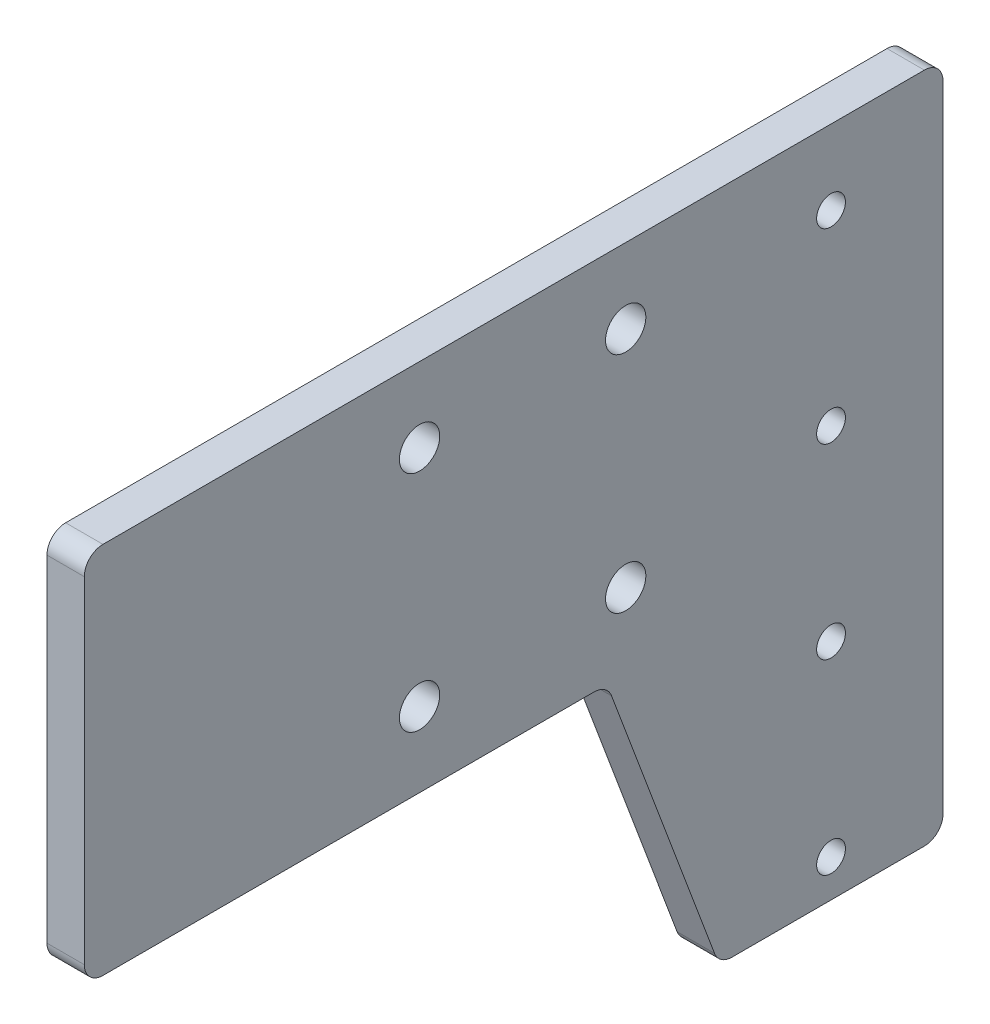
ISO-10303-21;
HEADER;
FILE_DESCRIPTION(('STEP AP214'),'2;1');
FILE_NAME('part.step','',(''),(''),'','','');
FILE_SCHEMA(('AUTOMOTIVE_DESIGN { 1 0 10303 214 1 1 1 1 }'));
ENDSEC;
DATA;
#1=APPLICATION_CONTEXT('core data for automotive mechanical design processes');
#2=APPLICATION_PROTOCOL_DEFINITION('international standard','automotive_design',2000,#1);
#3=PRODUCT_CONTEXT('',#1,'mechanical');
#4=PRODUCT('Part','Part','',(#3));
#5=PRODUCT_RELATED_PRODUCT_CATEGORY('part','',(#4));
#6=PRODUCT_DEFINITION_FORMATION('','',#4);
#7=PRODUCT_DEFINITION_CONTEXT('part definition',#1,'design');
#8=PRODUCT_DEFINITION('design','',#6,#7);
#9=PRODUCT_DEFINITION_SHAPE('','',#8);
#10=(LENGTH_UNIT() NAMED_UNIT(*) SI_UNIT(.MILLI.,.METRE.));
#11=(NAMED_UNIT(*) PLANE_ANGLE_UNIT() SI_UNIT($,.RADIAN.));
#12=(NAMED_UNIT(*) SI_UNIT($,.STERADIAN.) SOLID_ANGLE_UNIT());
#13=UNCERTAINTY_MEASURE_WITH_UNIT(LENGTH_MEASURE(1.E-05),#10,'distance_accuracy_value','');
#14=(GEOMETRIC_REPRESENTATION_CONTEXT(3) GLOBAL_UNCERTAINTY_ASSIGNED_CONTEXT((#13)) GLOBAL_UNIT_ASSIGNED_CONTEXT((#10,
#11,#12)) REPRESENTATION_CONTEXT('',''));
#15=CARTESIAN_POINT('',(0.,0.,0.));
#16=DIRECTION('',(0.,0.,1.));
#17=DIRECTION('',(1.,0.,0.));
#18=AXIS2_PLACEMENT_3D('',#15,#16,#17);
#19=CARTESIAN_POINT('',(6.35,0.,0.));
#20=DIRECTION('',(-1.,0.,0.));
#21=DIRECTION('',(0.,0.,1.));
#22=AXIS2_PLACEMENT_3D('',#19,#20,#21);
#23=PLANE('',#22);
#24=DIRECTION('',(0.,1.,0.));
#25=VECTOR('',#24,1.);
#26=CARTESIAN_POINT('',(6.35,114.3,0.));
#27=LINE('',#26,#25);
#28=CARTESIAN_POINT('',(6.35,3.175,0.));
#29=VERTEX_POINT('',#28);
#30=CARTESIAN_POINT('',(6.35,111.125,0.));
#31=VERTEX_POINT('',#30);
#32=EDGE_CURVE('E194',#29,#31,#27,.T.);
#33=ORIENTED_EDGE('',*,*,#32,.T.);
#34=CARTESIAN_POINT('',(6.35,111.125,3.17499999999998));
#35=DIRECTION('',(-1.,0.,0.));
#36=DIRECTION('',(0.,0.,1.));
#37=AXIS2_PLACEMENT_3D('',#34,#35,#36);
#38=CIRCLE('',#37,3.175);
#39=CARTESIAN_POINT('',(6.35,114.3,3.17499999999998));
#40=VERTEX_POINT('',#39);
#41=EDGE_CURVE('E224',#31,#40,#38,.F.);
#42=ORIENTED_EDGE('',*,*,#41,.T.);
#43=DIRECTION('',(0.,0.,1.));
#44=VECTOR('',#43,1.);
#45=CARTESIAN_POINT('',(6.35,114.3,146.05));
#46=LINE('',#45,#44);
#47=CARTESIAN_POINT('',(6.35,114.3,142.875));
#48=VERTEX_POINT('',#47);
#49=EDGE_CURVE('E162',#40,#48,#46,.T.);
#50=ORIENTED_EDGE('',*,*,#49,.T.);
#51=CARTESIAN_POINT('',(6.35,111.125,142.875));
#52=DIRECTION('',(-1.,0.,0.));
#53=DIRECTION('',(0.,0.,1.));
#54=AXIS2_PLACEMENT_3D('',#51,#52,#53);
#55=CIRCLE('',#54,3.175);
#56=CARTESIAN_POINT('',(6.35,111.125,146.05));
#57=VERTEX_POINT('',#56);
#58=EDGE_CURVE('E213',#48,#57,#55,.F.);
#59=ORIENTED_EDGE('',*,*,#58,.T.);
#60=DIRECTION('',(0.,-1.,0.));
#61=VECTOR('',#60,1.);
#62=CARTESIAN_POINT('',(6.35,50.8,146.05));
#63=LINE('',#62,#61);
#64=CARTESIAN_POINT('',(6.35,53.975,146.05));
#65=VERTEX_POINT('',#64);
#66=EDGE_CURVE('E280',#57,#65,#63,.T.);
#67=ORIENTED_EDGE('',*,*,#66,.T.);
#68=CARTESIAN_POINT('',(6.35,53.975,142.875));
#69=DIRECTION('',(-1.,0.,0.));
#70=DIRECTION('',(0.,0.,1.));
#71=AXIS2_PLACEMENT_3D('',#68,#69,#70);
#72=CIRCLE('',#71,3.175);
#73=CARTESIAN_POINT('',(6.35,50.8,142.875));
#74=VERTEX_POINT('',#73);
#75=EDGE_CURVE('E216',#65,#74,#72,.F.);
#76=ORIENTED_EDGE('',*,*,#75,.T.);
#77=DIRECTION('',(0.,0.,-1.));
#78=VECTOR('',#77,1.);
#79=CARTESIAN_POINT('',(6.35,50.8,57.15));
#80=LINE('',#79,#78);
#81=CARTESIAN_POINT('',(6.35,50.8,59.3502764864229));
#82=VERTEX_POINT('',#81);
#83=EDGE_CURVE('E271',#74,#82,#80,.T.);
#84=ORIENTED_EDGE('',*,*,#83,.T.);
#85=CARTESIAN_POINT('',(6.35,47.625,59.3502764864229));
#86=DIRECTION('',(-1.,0.,0.));
#87=DIRECTION('',(0.,0.,1.));
#88=AXIS2_PLACEMENT_3D('',#85,#86,#87);
#89=CIRCLE('',#88,3.175);
#90=CARTESIAN_POINT('',(6.35,48.7398169270432,56.3774313476412));
#91=VERTEX_POINT('',#90);
#92=EDGE_CURVE('E13',#82,#91,#89,.T.);
#93=ORIENTED_EDGE('',*,*,#92,.T.);
#94=DIRECTION('',(0.,-0.936329177569045,-0.351123441588391));
#95=VECTOR('',#94,1.);
#96=CARTESIAN_POINT('',(6.35,0.,38.1));
#97=LINE('',#96,#95);
#98=CARTESIAN_POINT('',(6.35,2.06018307295686,38.8725686523588));
#99=VERTEX_POINT('',#98);
#100=EDGE_CURVE('E270',#91,#99,#97,.T.);
#101=ORIENTED_EDGE('',*,*,#100,.T.);
#102=CARTESIAN_POINT('',(6.35,3.175,35.8997235135771));
#103=DIRECTION('',(-1.,0.,0.));
#104=DIRECTION('',(0.,0.,1.));
#105=AXIS2_PLACEMENT_3D('',#102,#103,#104);
#106=CIRCLE('',#105,3.175);
#107=CARTESIAN_POINT('',(6.35,0.,35.8997235135771));
#108=VERTEX_POINT('',#107);
#109=EDGE_CURVE('E73',#99,#108,#106,.F.);
#110=ORIENTED_EDGE('',*,*,#109,.T.);
#111=DIRECTION('',(0.,0.,-1.));
#112=VECTOR('',#111,1.);
#113=CARTESIAN_POINT('',(6.35,0.,0.));
#114=LINE('',#113,#112);
#115=CARTESIAN_POINT('',(6.35,0.,3.175));
#116=VERTEX_POINT('',#115);
#117=EDGE_CURVE('E196',#108,#116,#114,.T.);
#118=ORIENTED_EDGE('',*,*,#117,.T.);
#119=CARTESIAN_POINT('',(6.35,3.175,3.175));
#120=DIRECTION('',(-1.,0.,0.));
#121=DIRECTION('',(0.,0.,1.));
#122=AXIS2_PLACEMENT_3D('',#119,#120,#121);
#123=CIRCLE('',#122,3.175);
#124=EDGE_CURVE('E221',#116,#29,#123,.F.);
#125=ORIENTED_EDGE('',*,*,#124,.T.);
#126=EDGE_LOOP('',(#33,#42,#50,#59,#67,#76,#84,#93,#101,#110,#118,#125));
#127=FACE_BOUND('',#126,.T.);
#128=CARTESIAN_POINT('',(6.35,101.6,19.05));
#129=DIRECTION('',(1.,0.,0.));
#130=DIRECTION('',(0.,0.,-1.));
#131=AXIS2_PLACEMENT_3D('',#128,#129,#130);
#132=CIRCLE('',#131,2.4511);
#133=CARTESIAN_POINT('',(6.35,101.6,16.5989));
#134=VERTEX_POINT('',#133);
#135=EDGE_CURVE('E180',#134,#134,#132,.T.);
#136=ORIENTED_EDGE('',*,*,#135,.F.);
#137=EDGE_LOOP('',(#136));
#138=FACE_BOUND('',#137,.T.);
#139=CARTESIAN_POINT('',(6.35,101.6,53.975));
#140=DIRECTION('',(1.,0.,0.));
#141=DIRECTION('',(0.,0.,-1.));
#142=AXIS2_PLACEMENT_3D('',#139,#140,#141);
#143=CIRCLE('',#142,3.429);
#144=CARTESIAN_POINT('',(6.35,101.6,50.546));
#145=VERTEX_POINT('',#144);
#146=EDGE_CURVE('E294',#145,#145,#143,.T.);
#147=ORIENTED_EDGE('',*,*,#146,.F.);
#148=EDGE_LOOP('',(#147));
#149=FACE_BOUND('',#148,.T.);
#150=CARTESIAN_POINT('',(6.35,69.85,19.0499999999997));
#151=DIRECTION('',(1.,0.,0.));
#152=DIRECTION('',(0.,0.,-1.));
#153=AXIS2_PLACEMENT_3D('',#150,#151,#152);
#154=CIRCLE('',#153,2.4511);
#155=CARTESIAN_POINT('',(6.35,69.85,16.5988999999997));
#156=VERTEX_POINT('',#155);
#157=EDGE_CURVE('E302',#156,#156,#154,.T.);
#158=ORIENTED_EDGE('',*,*,#157,.F.);
#159=EDGE_LOOP('',(#158));
#160=FACE_BOUND('',#159,.T.);
#161=CARTESIAN_POINT('',(6.35,38.1,19.0499999999993));
#162=DIRECTION('',(1.,0.,0.));
#163=DIRECTION('',(0.,0.,-1.));
#164=AXIS2_PLACEMENT_3D('',#161,#162,#163);
#165=CIRCLE('',#164,2.4511);
#166=CARTESIAN_POINT('',(6.35,38.1,16.5988999999993));
#167=VERTEX_POINT('',#166);
#168=EDGE_CURVE('E310',#167,#167,#165,.T.);
#169=ORIENTED_EDGE('',*,*,#168,.F.);
#170=EDGE_LOOP('',(#169));
#171=FACE_BOUND('',#170,.T.);
#172=CARTESIAN_POINT('',(6.35,6.34999999999999,19.049999999999));
#173=DIRECTION('',(1.,0.,0.));
#174=DIRECTION('',(0.,0.,-1.));
#175=AXIS2_PLACEMENT_3D('',#172,#173,#174);
#176=CIRCLE('',#175,2.4511);
#177=CARTESIAN_POINT('',(6.35,6.34999999999999,16.598899999999));
#178=VERTEX_POINT('',#177);
#179=EDGE_CURVE('E318',#178,#178,#176,.T.);
#180=ORIENTED_EDGE('',*,*,#179,.F.);
#181=EDGE_LOOP('',(#180));
#182=FACE_BOUND('',#181,.T.);
#183=CARTESIAN_POINT('',(6.35,101.6,89.027));
#184=DIRECTION('',(1.,0.,0.));
#185=DIRECTION('',(0.,0.,-1.));
#186=AXIS2_PLACEMENT_3D('',#183,#184,#185);
#187=CIRCLE('',#186,3.429);
#188=CARTESIAN_POINT('',(6.35,101.6,85.598));
#189=VERTEX_POINT('',#188);
#190=EDGE_CURVE('E326',#189,#189,#187,.T.);
#191=ORIENTED_EDGE('',*,*,#190,.F.);
#192=EDGE_LOOP('',(#191));
#193=FACE_BOUND('',#192,.T.);
#194=CARTESIAN_POINT('',(6.35,63.4999999999998,89.0269999999996));
#195=DIRECTION('',(1.,0.,0.));
#196=DIRECTION('',(0.,0.,-1.));
#197=AXIS2_PLACEMENT_3D('',#194,#195,#196);
#198=CIRCLE('',#197,3.429);
#199=CARTESIAN_POINT('',(6.35,63.4999999999998,85.5979999999996));
#200=VERTEX_POINT('',#199);
#201=EDGE_CURVE('E334',#200,#200,#198,.T.);
#202=ORIENTED_EDGE('',*,*,#201,.F.);
#203=EDGE_LOOP('',(#202));
#204=FACE_BOUND('',#203,.T.);
#205=CARTESIAN_POINT('',(6.35,63.5,53.9749999999996));
#206=DIRECTION('',(1.,0.,0.));
#207=DIRECTION('',(0.,0.,-1.));
#208=AXIS2_PLACEMENT_3D('',#205,#206,#207);
#209=CIRCLE('',#208,3.429);
#210=CARTESIAN_POINT('',(6.35,63.5,50.5459999999996));
#211=VERTEX_POINT('',#210);
#212=EDGE_CURVE('E342',#211,#211,#209,.T.);
#213=ORIENTED_EDGE('',*,*,#212,.F.);
#214=EDGE_LOOP('',(#213));
#215=FACE_BOUND('',#214,.T.);
#216=ADVANCED_FACE('F50',(#127,#138,#149,#160,#171,#182,#193,#204,#215),#23,.F.);
#217=CARTESIAN_POINT('',(0.,0.,0.));
#218=DIRECTION('',(-1.,0.,0.));
#219=DIRECTION('',(0.,0.,1.));
#220=AXIS2_PLACEMENT_3D('',#217,#218,#219);
#221=PLANE('',#220);
#222=CARTESIAN_POINT('',(0.,63.4999999999998,89.0269999999996));
#223=DIRECTION('',(1.,0.,0.));
#224=DIRECTION('',(0.,0.,-1.));
#225=AXIS2_PLACEMENT_3D('',#222,#223,#224);
#226=CIRCLE('',#225,3.429);
#227=CARTESIAN_POINT('',(0.,63.4999999999998,85.5979999999996));
#228=VERTEX_POINT('',#227);
#229=EDGE_CURVE('E338',#228,#228,#226,.T.);
#230=ORIENTED_EDGE('',*,*,#229,.T.);
#231=EDGE_LOOP('',(#230));
#232=FACE_BOUND('',#231,.T.);
#233=CARTESIAN_POINT('',(0.,6.34999999999999,19.049999999999));
#234=DIRECTION('',(1.,0.,0.));
#235=DIRECTION('',(0.,0.,-1.));
#236=AXIS2_PLACEMENT_3D('',#233,#234,#235);
#237=CIRCLE('',#236,2.4511);
#238=CARTESIAN_POINT('',(0.,6.34999999999999,16.598899999999));
#239=VERTEX_POINT('',#238);
#240=EDGE_CURVE('E322',#239,#239,#237,.T.);
#241=ORIENTED_EDGE('',*,*,#240,.T.);
#242=EDGE_LOOP('',(#241));
#243=FACE_BOUND('',#242,.T.);
#244=CARTESIAN_POINT('',(0.,69.85,19.0499999999997));
#245=DIRECTION('',(1.,0.,0.));
#246=DIRECTION('',(0.,0.,-1.));
#247=AXIS2_PLACEMENT_3D('',#244,#245,#246);
#248=CIRCLE('',#247,2.4511);
#249=CARTESIAN_POINT('',(0.,69.85,16.5988999999997));
#250=VERTEX_POINT('',#249);
#251=EDGE_CURVE('E306',#250,#250,#248,.T.);
#252=ORIENTED_EDGE('',*,*,#251,.T.);
#253=EDGE_LOOP('',(#252));
#254=FACE_BOUND('',#253,.T.);
#255=CARTESIAN_POINT('',(0.,101.6,19.05));
#256=DIRECTION('',(1.,0.,0.));
#257=DIRECTION('',(0.,0.,-1.));
#258=AXIS2_PLACEMENT_3D('',#255,#256,#257);
#259=CIRCLE('',#258,2.4511);
#260=CARTESIAN_POINT('',(0.,101.6,16.5989));
#261=VERTEX_POINT('',#260);
#262=EDGE_CURVE('E290',#261,#261,#259,.T.);
#263=ORIENTED_EDGE('',*,*,#262,.T.);
#264=EDGE_LOOP('',(#263));
#265=FACE_BOUND('',#264,.T.);
#266=DIRECTION('',(0.,0.,1.));
#267=VECTOR('',#266,1.);
#268=CARTESIAN_POINT('',(0.,114.3,146.05));
#269=LINE('',#268,#267);
#270=CARTESIAN_POINT('',(0.,114.3,3.17499999999998));
#271=VERTEX_POINT('',#270);
#272=CARTESIAN_POINT('',(0.,114.3,142.875));
#273=VERTEX_POINT('',#272);
#274=EDGE_CURVE('E159',#271,#273,#269,.T.);
#275=ORIENTED_EDGE('',*,*,#274,.F.);
#276=CARTESIAN_POINT('',(0.,111.125,3.17499999999998));
#277=DIRECTION('',(-1.,0.,0.));
#278=DIRECTION('',(0.,0.,1.));
#279=AXIS2_PLACEMENT_3D('',#276,#277,#278);
#280=CIRCLE('',#279,3.175);
#281=CARTESIAN_POINT('',(0.,111.125,0.));
#282=VERTEX_POINT('',#281);
#283=EDGE_CURVE('E141',#271,#282,#280,.T.);
#284=ORIENTED_EDGE('',*,*,#283,.T.);
#285=DIRECTION('',(0.,1.,0.));
#286=VECTOR('',#285,1.);
#287=CARTESIAN_POINT('',(0.,114.3,0.));
#288=LINE('',#287,#286);
#289=CARTESIAN_POINT('',(0.,3.175,0.));
#290=VERTEX_POINT('',#289);
#291=EDGE_CURVE('E172',#290,#282,#288,.T.);
#292=ORIENTED_EDGE('',*,*,#291,.F.);
#293=CARTESIAN_POINT('',(0.,3.175,3.175));
#294=DIRECTION('',(-1.,0.,0.));
#295=DIRECTION('',(0.,0.,1.));
#296=AXIS2_PLACEMENT_3D('',#293,#294,#295);
#297=CIRCLE('',#296,3.175);
#298=CARTESIAN_POINT('',(0.,0.,3.175));
#299=VERTEX_POINT('',#298);
#300=EDGE_CURVE('E153',#290,#299,#297,.T.);
#301=ORIENTED_EDGE('',*,*,#300,.T.);
#302=DIRECTION('',(0.,0.,-1.));
#303=VECTOR('',#302,1.);
#304=CARTESIAN_POINT('',(0.,0.,0.));
#305=LINE('',#304,#303);
#306=CARTESIAN_POINT('',(0.,0.,35.8997235135771));
#307=VERTEX_POINT('',#306);
#308=EDGE_CURVE('E191',#307,#299,#305,.T.);
#309=ORIENTED_EDGE('',*,*,#308,.F.);
#310=CARTESIAN_POINT('',(0.,3.175,35.8997235135771));
#311=DIRECTION('',(-1.,0.,0.));
#312=DIRECTION('',(0.,0.,1.));
#313=AXIS2_PLACEMENT_3D('',#310,#311,#312);
#314=CIRCLE('',#313,3.175);
#315=CARTESIAN_POINT('',(0.,2.06018307295686,38.8725686523588));
#316=VERTEX_POINT('',#315);
#317=EDGE_CURVE('E203',#307,#316,#314,.T.);
#318=ORIENTED_EDGE('',*,*,#317,.T.);
#319=DIRECTION('',(0.,-0.936329177569045,-0.351123441588391));
#320=VECTOR('',#319,1.);
#321=CARTESIAN_POINT('',(0.,0.,38.1));
#322=LINE('',#321,#320);
#323=CARTESIAN_POINT('',(0.,48.7398169270432,56.3774313476412));
#324=VERTEX_POINT('',#323);
#325=EDGE_CURVE('E187',#324,#316,#322,.T.);
#326=ORIENTED_EDGE('',*,*,#325,.F.);
#327=CARTESIAN_POINT('',(0.,47.625,59.3502764864229));
#328=DIRECTION('',(-1.,0.,0.));
#329=DIRECTION('',(0.,0.,1.));
#330=AXIS2_PLACEMENT_3D('',#327,#328,#329);
#331=CIRCLE('',#330,3.175);
#332=CARTESIAN_POINT('',(0.,50.8,59.3502764864229));
#333=VERTEX_POINT('',#332);
#334=EDGE_CURVE('E59',#324,#333,#331,.F.);
#335=ORIENTED_EDGE('',*,*,#334,.T.);
#336=DIRECTION('',(0.,0.,-1.));
#337=VECTOR('',#336,1.);
#338=CARTESIAN_POINT('',(0.,50.8,57.15));
#339=LINE('',#338,#337);
#340=CARTESIAN_POINT('',(0.,50.8,142.875));
#341=VERTEX_POINT('',#340);
#342=EDGE_CURVE('E178',#341,#333,#339,.T.);
#343=ORIENTED_EDGE('',*,*,#342,.F.);
#344=CARTESIAN_POINT('',(0.,53.975,142.875));
#345=DIRECTION('',(-1.,0.,0.));
#346=DIRECTION('',(0.,0.,1.));
#347=AXIS2_PLACEMENT_3D('',#344,#345,#346);
#348=CIRCLE('',#347,3.175);
#349=CARTESIAN_POINT('',(0.,53.975,146.05));
#350=VERTEX_POINT('',#349);
#351=EDGE_CURVE('E200',#341,#350,#348,.T.);
#352=ORIENTED_EDGE('',*,*,#351,.T.);
#353=DIRECTION('',(0.,-1.,0.));
#354=VECTOR('',#353,1.);
#355=CARTESIAN_POINT('',(0.,50.8,146.05));
#356=LINE('',#355,#354);
#357=CARTESIAN_POINT('',(0.,111.125,146.05));
#358=VERTEX_POINT('',#357);
#359=EDGE_CURVE('E171',#358,#350,#356,.T.);
#360=ORIENTED_EDGE('',*,*,#359,.F.);
#361=CARTESIAN_POINT('',(0.,111.125,142.875));
#362=DIRECTION('',(-1.,0.,0.));
#363=DIRECTION('',(0.,0.,1.));
#364=AXIS2_PLACEMENT_3D('',#361,#362,#363);
#365=CIRCLE('',#364,3.175);
#366=EDGE_CURVE('E164',#358,#273,#365,.T.);
#367=ORIENTED_EDGE('',*,*,#366,.T.);
#368=EDGE_LOOP('',(#275,#284,#292,#301,#309,#318,#326,#335,#343,#352,#360,#367));
#369=FACE_BOUND('',#368,.T.);
#370=CARTESIAN_POINT('',(0.,101.6,53.975));
#371=DIRECTION('',(1.,0.,0.));
#372=DIRECTION('',(0.,0.,-1.));
#373=AXIS2_PLACEMENT_3D('',#370,#371,#372);
#374=CIRCLE('',#373,3.429);
#375=CARTESIAN_POINT('',(0.,101.6,50.546));
#376=VERTEX_POINT('',#375);
#377=EDGE_CURVE('E298',#376,#376,#374,.T.);
#378=ORIENTED_EDGE('',*,*,#377,.T.);
#379=EDGE_LOOP('',(#378));
#380=FACE_BOUND('',#379,.T.);
#381=CARTESIAN_POINT('',(0.,38.1,19.0499999999993));
#382=DIRECTION('',(1.,0.,0.));
#383=DIRECTION('',(0.,0.,-1.));
#384=AXIS2_PLACEMENT_3D('',#381,#382,#383);
#385=CIRCLE('',#384,2.4511);
#386=CARTESIAN_POINT('',(0.,38.1,16.5988999999993));
#387=VERTEX_POINT('',#386);
#388=EDGE_CURVE('E314',#387,#387,#385,.T.);
#389=ORIENTED_EDGE('',*,*,#388,.T.);
#390=EDGE_LOOP('',(#389));
#391=FACE_BOUND('',#390,.T.);
#392=CARTESIAN_POINT('',(0.,101.6,89.027));
#393=DIRECTION('',(1.,0.,0.));
#394=DIRECTION('',(0.,0.,-1.));
#395=AXIS2_PLACEMENT_3D('',#392,#393,#394);
#396=CIRCLE('',#395,3.429);
#397=CARTESIAN_POINT('',(0.,101.6,85.598));
#398=VERTEX_POINT('',#397);
#399=EDGE_CURVE('E330',#398,#398,#396,.T.);
#400=ORIENTED_EDGE('',*,*,#399,.T.);
#401=EDGE_LOOP('',(#400));
#402=FACE_BOUND('',#401,.T.);
#403=CARTESIAN_POINT('',(0.,63.5,53.9749999999996));
#404=DIRECTION('',(1.,0.,0.));
#405=DIRECTION('',(0.,0.,-1.));
#406=AXIS2_PLACEMENT_3D('',#403,#404,#405);
#407=CIRCLE('',#406,3.429);
#408=CARTESIAN_POINT('',(0.,63.5,50.5459999999996));
#409=VERTEX_POINT('',#408);
#410=EDGE_CURVE('E346',#409,#409,#407,.T.);
#411=ORIENTED_EDGE('',*,*,#410,.T.);
#412=EDGE_LOOP('',(#411));
#413=FACE_BOUND('',#412,.T.);
#414=ADVANCED_FACE('F167',(#232,#243,#254,#265,#369,#380,#391,#402,#413),#221,.T.);
#415=CARTESIAN_POINT('',(6.35,114.3,0.));
#416=DIRECTION('',(0.,0.,1.));
#417=DIRECTION('',(0.,-1.,0.));
#418=AXIS2_PLACEMENT_3D('',#415,#416,#417);
#419=PLANE('',#418);
#420=ORIENTED_EDGE('',*,*,#291,.T.);
#421=DIRECTION('',(-1.,0.,0.));
#422=VECTOR('',#421,1.);
#423=CARTESIAN_POINT('',(6.35,111.125,0.));
#424=LINE('',#423,#422);
#425=EDGE_CURVE('E146',#282,#31,#424,.F.);
#426=ORIENTED_EDGE('',*,*,#425,.T.);
#427=ORIENTED_EDGE('',*,*,#32,.F.);
#428=DIRECTION('',(-1.,0.,0.));
#429=VECTOR('',#428,1.);
#430=CARTESIAN_POINT('',(6.35,3.175,0.));
#431=LINE('',#430,#429);
#432=EDGE_CURVE('E152',#29,#290,#431,.T.);
#433=ORIENTED_EDGE('',*,*,#432,.T.);
#434=EDGE_LOOP('',(#420,#426,#427,#433));
#435=FACE_BOUND('',#434,.T.);
#436=ADVANCED_FACE('F363',(#435),#419,.F.);
#437=CARTESIAN_POINT('',(6.35,114.3,146.05));
#438=DIRECTION('',(0.,-1.,0.));
#439=DIRECTION('',(0.,0.,-1.));
#440=AXIS2_PLACEMENT_3D('',#437,#438,#439);
#441=PLANE('',#440);
#442=ORIENTED_EDGE('',*,*,#49,.F.);
#443=DIRECTION('',(-1.,0.,0.));
#444=VECTOR('',#443,1.);
#445=CARTESIAN_POINT('',(6.35,114.3,3.17499999999998));
#446=LINE('',#445,#444);
#447=EDGE_CURVE('E145',#40,#271,#446,.T.);
#448=ORIENTED_EDGE('',*,*,#447,.T.);
#449=ORIENTED_EDGE('',*,*,#274,.T.);
#450=DIRECTION('',(-1.,0.,0.));
#451=VECTOR('',#450,1.);
#452=CARTESIAN_POINT('',(6.35,114.3,142.875));
#453=LINE('',#452,#451);
#454=EDGE_CURVE('E165',#273,#48,#453,.F.);
#455=ORIENTED_EDGE('',*,*,#454,.T.);
#456=EDGE_LOOP('',(#442,#448,#449,#455));
#457=FACE_BOUND('',#456,.T.);
#458=ADVANCED_FACE('F158',(#457),#441,.F.);
#459=CARTESIAN_POINT('',(6.35,50.8,146.05));
#460=DIRECTION('',(0.,0.,-1.));
#461=DIRECTION('',(-1.,0.,0.));
#462=AXIS2_PLACEMENT_3D('',#459,#460,#461);
#463=PLANE('',#462);
#464=ORIENTED_EDGE('',*,*,#359,.T.);
#465=DIRECTION('',(-1.,0.,0.));
#466=VECTOR('',#465,1.);
#467=CARTESIAN_POINT('',(6.35,53.975,146.05));
#468=LINE('',#467,#466);
#469=EDGE_CURVE('E251',#350,#65,#468,.F.);
#470=ORIENTED_EDGE('',*,*,#469,.T.);
#471=ORIENTED_EDGE('',*,*,#66,.F.);
#472=DIRECTION('',(-1.,0.,0.));
#473=VECTOR('',#472,1.);
#474=CARTESIAN_POINT('',(6.35,111.125,146.05));
#475=LINE('',#474,#473);
#476=EDGE_CURVE('E247',#57,#358,#475,.T.);
#477=ORIENTED_EDGE('',*,*,#476,.T.);
#478=EDGE_LOOP('',(#464,#470,#471,#477));
#479=FACE_BOUND('',#478,.T.);
#480=ADVANCED_FACE('F377',(#479),#463,.F.);
#481=CARTESIAN_POINT('',(6.35,50.8,57.15));
#482=DIRECTION('',(0.,1.,0.));
#483=DIRECTION('',(0.,0.,1.));
#484=AXIS2_PLACEMENT_3D('',#481,#482,#483);
#485=PLANE('',#484);
#486=ORIENTED_EDGE('',*,*,#342,.T.);
#487=DIRECTION('',(-1.,0.,0.));
#488=VECTOR('',#487,1.);
#489=CARTESIAN_POINT('',(6.35,50.8,59.3502764864229));
#490=LINE('',#489,#488);
#491=EDGE_CURVE('E244',#333,#82,#490,.F.);
#492=ORIENTED_EDGE('',*,*,#491,.T.);
#493=ORIENTED_EDGE('',*,*,#83,.F.);
#494=DIRECTION('',(-1.,0.,0.));
#495=VECTOR('',#494,1.);
#496=CARTESIAN_POINT('',(6.35,50.8,142.875));
#497=LINE('',#496,#495);
#498=EDGE_CURVE('E240',#74,#341,#497,.T.);
#499=ORIENTED_EDGE('',*,*,#498,.T.);
#500=EDGE_LOOP('',(#486,#492,#493,#499));
#501=FACE_BOUND('',#500,.T.);
#502=ADVANCED_FACE('F261',(#501),#485,.F.);
#503=CARTESIAN_POINT('',(6.35,0.,38.1));
#504=DIRECTION('',(0.,0.351123441588391,-0.936329177569045));
#505=DIRECTION('',(0.,0.936329177569045,0.351123441588391));
#506=AXIS2_PLACEMENT_3D('',#503,#504,#505);
#507=PLANE('',#506);
#508=ORIENTED_EDGE('',*,*,#100,.F.);
#509=DIRECTION('',(-1.,0.,0.));
#510=VECTOR('',#509,1.);
#511=CARTESIAN_POINT('',(0.,48.7398169270432,56.3774313476412));
#512=LINE('',#511,#510);
#513=EDGE_CURVE('E236',#91,#324,#512,.T.);
#514=ORIENTED_EDGE('',*,*,#513,.T.);
#515=ORIENTED_EDGE('',*,*,#325,.T.);
#516=DIRECTION('',(-1.,0.,0.));
#517=VECTOR('',#516,1.);
#518=CARTESIAN_POINT('',(6.35,2.06018307295686,38.8725686523588));
#519=LINE('',#518,#517);
#520=EDGE_CURVE('E233',#316,#99,#519,.F.);
#521=ORIENTED_EDGE('',*,*,#520,.T.);
#522=EDGE_LOOP('',(#508,#514,#515,#521));
#523=FACE_BOUND('',#522,.T.);
#524=ADVANCED_FACE('F273',(#523),#507,.F.);
#525=CARTESIAN_POINT('',(6.35,0.,0.));
#526=DIRECTION('',(0.,1.,0.));
#527=DIRECTION('',(0.,0.,1.));
#528=AXIS2_PLACEMENT_3D('',#525,#526,#527);
#529=PLANE('',#528);
#530=ORIENTED_EDGE('',*,*,#308,.T.);
#531=DIRECTION('',(-1.,0.,0.));
#532=VECTOR('',#531,1.);
#533=CARTESIAN_POINT('',(6.35,0.,3.175));
#534=LINE('',#533,#532);
#535=EDGE_CURVE('E66',#299,#116,#534,.F.);
#536=ORIENTED_EDGE('',*,*,#535,.T.);
#537=ORIENTED_EDGE('',*,*,#117,.F.);
#538=DIRECTION('',(-1.,0.,0.));
#539=VECTOR('',#538,1.);
#540=CARTESIAN_POINT('',(6.35,0.,35.8997235135771));
#541=LINE('',#540,#539);
#542=EDGE_CURVE('E227',#108,#307,#541,.T.);
#543=ORIENTED_EDGE('',*,*,#542,.T.);
#544=EDGE_LOOP('',(#530,#536,#537,#543));
#545=FACE_BOUND('',#544,.T.);
#546=ADVANCED_FACE('F370',(#545),#529,.F.);
#547=CARTESIAN_POINT('',(6.35,101.6,19.05));
#548=DIRECTION('',(-1.,0.,0.));
#549=DIRECTION('',(0.,0.,1.));
#550=AXIS2_PLACEMENT_3D('',#547,#548,#549);
#551=CYLINDRICAL_SURFACE('',#550,2.4511);
#552=ORIENTED_EDGE('',*,*,#135,.T.);
#553=EDGE_LOOP('',(#552));
#554=FACE_BOUND('',#553,.T.);
#555=ORIENTED_EDGE('',*,*,#262,.F.);
#556=EDGE_LOOP('',(#555));
#557=FACE_BOUND('',#556,.T.);
#558=ADVANCED_FACE('F367',(#554,#557),#551,.F.);
#559=CARTESIAN_POINT('',(6.35,101.6,53.975));
#560=DIRECTION('',(-1.,0.,0.));
#561=DIRECTION('',(0.,0.,1.));
#562=AXIS2_PLACEMENT_3D('',#559,#560,#561);
#563=CYLINDRICAL_SURFACE('',#562,3.429);
#564=ORIENTED_EDGE('',*,*,#146,.T.);
#565=EDGE_LOOP('',(#564));
#566=FACE_BOUND('',#565,.T.);
#567=ORIENTED_EDGE('',*,*,#377,.F.);
#568=EDGE_LOOP('',(#567));
#569=FACE_BOUND('',#568,.T.);
#570=ADVANCED_FACE('F504',(#566,#569),#563,.F.);
#571=CARTESIAN_POINT('',(6.35,69.85,19.0499999999997));
#572=DIRECTION('',(-1.,0.,0.));
#573=DIRECTION('',(0.,0.,1.));
#574=AXIS2_PLACEMENT_3D('',#571,#572,#573);
#575=CYLINDRICAL_SURFACE('',#574,2.4511);
#576=ORIENTED_EDGE('',*,*,#157,.T.);
#577=EDGE_LOOP('',(#576));
#578=FACE_BOUND('',#577,.T.);
#579=ORIENTED_EDGE('',*,*,#251,.F.);
#580=EDGE_LOOP('',(#579));
#581=FACE_BOUND('',#580,.T.);
#582=ADVANCED_FACE('F494',(#578,#581),#575,.F.);
#583=CARTESIAN_POINT('',(6.35,38.1,19.0499999999993));
#584=DIRECTION('',(-1.,0.,0.));
#585=DIRECTION('',(0.,0.,1.));
#586=AXIS2_PLACEMENT_3D('',#583,#584,#585);
#587=CYLINDRICAL_SURFACE('',#586,2.4511);
#588=ORIENTED_EDGE('',*,*,#168,.T.);
#589=EDGE_LOOP('',(#588));
#590=FACE_BOUND('',#589,.T.);
#591=ORIENTED_EDGE('',*,*,#388,.F.);
#592=EDGE_LOOP('',(#591));
#593=FACE_BOUND('',#592,.T.);
#594=ADVANCED_FACE('F484',(#590,#593),#587,.F.);
#595=CARTESIAN_POINT('',(6.35,6.34999999999999,19.049999999999));
#596=DIRECTION('',(-1.,0.,0.));
#597=DIRECTION('',(0.,0.,1.));
#598=AXIS2_PLACEMENT_3D('',#595,#596,#597);
#599=CYLINDRICAL_SURFACE('',#598,2.4511);
#600=ORIENTED_EDGE('',*,*,#179,.T.);
#601=EDGE_LOOP('',(#600));
#602=FACE_BOUND('',#601,.T.);
#603=ORIENTED_EDGE('',*,*,#240,.F.);
#604=EDGE_LOOP('',(#603));
#605=FACE_BOUND('',#604,.T.);
#606=ADVANCED_FACE('F474',(#602,#605),#599,.F.);
#607=CARTESIAN_POINT('',(6.35,101.6,89.027));
#608=DIRECTION('',(-1.,0.,0.));
#609=DIRECTION('',(0.,0.,1.));
#610=AXIS2_PLACEMENT_3D('',#607,#608,#609);
#611=CYLINDRICAL_SURFACE('',#610,3.429);
#612=ORIENTED_EDGE('',*,*,#190,.T.);
#613=EDGE_LOOP('',(#612));
#614=FACE_BOUND('',#613,.T.);
#615=ORIENTED_EDGE('',*,*,#399,.F.);
#616=EDGE_LOOP('',(#615));
#617=FACE_BOUND('',#616,.T.);
#618=ADVANCED_FACE('F464',(#614,#617),#611,.F.);
#619=CARTESIAN_POINT('',(6.35,63.4999999999998,89.0269999999996));
#620=DIRECTION('',(-1.,0.,0.));
#621=DIRECTION('',(0.,0.,1.));
#622=AXIS2_PLACEMENT_3D('',#619,#620,#621);
#623=CYLINDRICAL_SURFACE('',#622,3.429);
#624=ORIENTED_EDGE('',*,*,#201,.T.);
#625=EDGE_LOOP('',(#624));
#626=FACE_BOUND('',#625,.T.);
#627=ORIENTED_EDGE('',*,*,#229,.F.);
#628=EDGE_LOOP('',(#627));
#629=FACE_BOUND('',#628,.T.);
#630=ADVANCED_FACE('F454',(#626,#629),#623,.F.);
#631=CARTESIAN_POINT('',(6.35,63.5,53.9749999999996));
#632=DIRECTION('',(-1.,0.,0.));
#633=DIRECTION('',(0.,0.,1.));
#634=AXIS2_PLACEMENT_3D('',#631,#632,#633);
#635=CYLINDRICAL_SURFACE('',#634,3.429);
#636=ORIENTED_EDGE('',*,*,#212,.T.);
#637=EDGE_LOOP('',(#636));
#638=FACE_BOUND('',#637,.T.);
#639=ORIENTED_EDGE('',*,*,#410,.F.);
#640=EDGE_LOOP('',(#639));
#641=FACE_BOUND('',#640,.T.);
#642=ADVANCED_FACE('F355',(#638,#641),#635,.F.);
#643=CARTESIAN_POINT('',(6.35,111.125,3.17499999999998));
#644=DIRECTION('',(-1.,0.,0.));
#645=DIRECTION('',(0.,0.,1.));
#646=AXIS2_PLACEMENT_3D('',#643,#644,#645);
#647=CYLINDRICAL_SURFACE('',#646,3.175);
#648=ORIENTED_EDGE('',*,*,#41,.F.);
#649=ORIENTED_EDGE('',*,*,#425,.F.);
#650=ORIENTED_EDGE('',*,*,#283,.F.);
#651=ORIENTED_EDGE('',*,*,#447,.F.);
#652=EDGE_LOOP('',(#648,#649,#650,#651));
#653=FACE_BOUND('',#652,.T.);
#654=ADVANCED_FACE('F144',(#653),#647,.T.);
#655=CARTESIAN_POINT('',(6.35,3.175,3.175));
#656=DIRECTION('',(-1.,0.,0.));
#657=DIRECTION('',(0.,0.,1.));
#658=AXIS2_PLACEMENT_3D('',#655,#656,#657);
#659=CYLINDRICAL_SURFACE('',#658,3.175);
#660=ORIENTED_EDGE('',*,*,#124,.F.);
#661=ORIENTED_EDGE('',*,*,#535,.F.);
#662=ORIENTED_EDGE('',*,*,#300,.F.);
#663=ORIENTED_EDGE('',*,*,#432,.F.);
#664=EDGE_LOOP('',(#660,#661,#662,#663));
#665=FACE_BOUND('',#664,.T.);
#666=ADVANCED_FACE('F388',(#665),#659,.T.);
#667=CARTESIAN_POINT('',(6.35,47.625,59.3502764864229));
#668=DIRECTION('',(1.,0.,0.));
#669=DIRECTION('',(0.,0.,-1.));
#670=AXIS2_PLACEMENT_3D('',#667,#668,#669);
#671=CYLINDRICAL_SURFACE('',#670,3.175);
#672=ORIENTED_EDGE('',*,*,#92,.F.);
#673=ORIENTED_EDGE('',*,*,#491,.F.);
#674=ORIENTED_EDGE('',*,*,#334,.F.);
#675=ORIENTED_EDGE('',*,*,#513,.F.);
#676=EDGE_LOOP('',(#672,#673,#674,#675));
#677=FACE_BOUND('',#676,.T.);
#678=ADVANCED_FACE('F266',(#677),#671,.F.);
#679=CARTESIAN_POINT('',(6.35,3.175,35.8997235135771));
#680=DIRECTION('',(-1.,0.,0.));
#681=DIRECTION('',(0.,0.,1.));
#682=AXIS2_PLACEMENT_3D('',#679,#680,#681);
#683=CYLINDRICAL_SURFACE('',#682,3.175);
#684=ORIENTED_EDGE('',*,*,#109,.F.);
#685=ORIENTED_EDGE('',*,*,#520,.F.);
#686=ORIENTED_EDGE('',*,*,#317,.F.);
#687=ORIENTED_EDGE('',*,*,#542,.F.);
#688=EDGE_LOOP('',(#684,#685,#686,#687));
#689=FACE_BOUND('',#688,.T.);
#690=ADVANCED_FACE('F394',(#689),#683,.T.);
#691=CARTESIAN_POINT('',(6.35,53.975,142.875));
#692=DIRECTION('',(-1.,0.,0.));
#693=DIRECTION('',(0.,0.,1.));
#694=AXIS2_PLACEMENT_3D('',#691,#692,#693);
#695=CYLINDRICAL_SURFACE('',#694,3.175);
#696=ORIENTED_EDGE('',*,*,#75,.F.);
#697=ORIENTED_EDGE('',*,*,#469,.F.);
#698=ORIENTED_EDGE('',*,*,#351,.F.);
#699=ORIENTED_EDGE('',*,*,#498,.F.);
#700=EDGE_LOOP('',(#696,#697,#698,#699));
#701=FACE_BOUND('',#700,.T.);
#702=ADVANCED_FACE('F396',(#701),#695,.T.);
#703=CARTESIAN_POINT('',(6.35,111.125,142.875));
#704=DIRECTION('',(-1.,0.,0.));
#705=DIRECTION('',(0.,0.,1.));
#706=AXIS2_PLACEMENT_3D('',#703,#704,#705);
#707=CYLINDRICAL_SURFACE('',#706,3.175);
#708=ORIENTED_EDGE('',*,*,#58,.F.);
#709=ORIENTED_EDGE('',*,*,#454,.F.);
#710=ORIENTED_EDGE('',*,*,#366,.F.);
#711=ORIENTED_EDGE('',*,*,#476,.F.);
#712=EDGE_LOOP('',(#708,#709,#710,#711));
#713=FACE_BOUND('',#712,.T.);
#714=ADVANCED_FACE('F52',(#713),#707,.T.);
#715=CLOSED_SHELL('',(#216,#414,#436,#458,#480,#502,#524,#546,#558,#570,#582,#594,#606,#618,
#630,#642,#654,#666,#678,#690,#702,#714));
#716=MANIFOLD_SOLID_BREP('B2',#715);
#717=ADVANCED_BREP_SHAPE_REPRESENTATION('',(#18,#716),#14);
#718=SHAPE_DEFINITION_REPRESENTATION(#9,#717);
ENDSEC;
END-ISO-10303-21;
